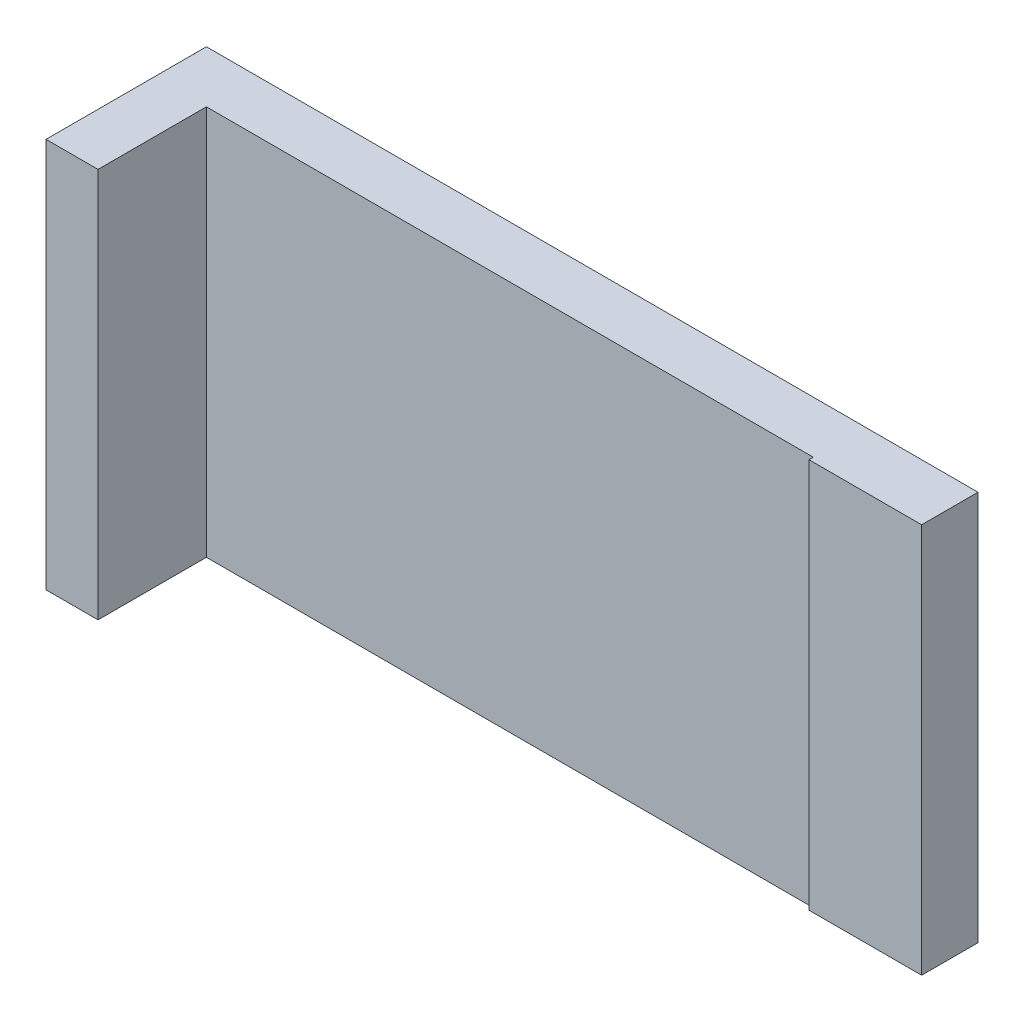
ISO-10303-21;
HEADER;
FILE_DESCRIPTION(('STEP AP214'),'2;1');
FILE_NAME('part.step','',(''),(''),'','','');
FILE_SCHEMA(('AUTOMOTIVE_DESIGN { 1 0 10303 214 1 1 1 1 }'));
ENDSEC;
DATA;
#1=APPLICATION_CONTEXT('core data for automotive mechanical design processes');
#2=APPLICATION_PROTOCOL_DEFINITION('international standard','automotive_design',2000,#1);
#3=PRODUCT_CONTEXT('',#1,'mechanical');
#4=PRODUCT('Part','Part','',(#3));
#5=PRODUCT_RELATED_PRODUCT_CATEGORY('part','',(#4));
#6=PRODUCT_DEFINITION_FORMATION('','',#4);
#7=PRODUCT_DEFINITION_CONTEXT('part definition',#1,'design');
#8=PRODUCT_DEFINITION('design','',#6,#7);
#9=PRODUCT_DEFINITION_SHAPE('','',#8);
#10=(LENGTH_UNIT() NAMED_UNIT(*) SI_UNIT(.MILLI.,.METRE.));
#11=(NAMED_UNIT(*) PLANE_ANGLE_UNIT() SI_UNIT($,.RADIAN.));
#12=(NAMED_UNIT(*) SI_UNIT($,.STERADIAN.) SOLID_ANGLE_UNIT());
#13=UNCERTAINTY_MEASURE_WITH_UNIT(LENGTH_MEASURE(1.E-05),#10,'distance_accuracy_value','');
#14=(GEOMETRIC_REPRESENTATION_CONTEXT(3) GLOBAL_UNCERTAINTY_ASSIGNED_CONTEXT((#13)) GLOBAL_UNIT_ASSIGNED_CONTEXT((#10,
#11,#12)) REPRESENTATION_CONTEXT('',''));
#15=CARTESIAN_POINT('',(0.,0.,0.));
#16=DIRECTION('',(0.,0.,1.));
#17=DIRECTION('',(1.,0.,0.));
#18=AXIS2_PLACEMENT_3D('',#15,#16,#17);
#19=CARTESIAN_POINT('',(0.,0.,0.));
#20=DIRECTION('',(0.,0.,-1.));
#21=DIRECTION('',(-1.,0.,0.));
#22=AXIS2_PLACEMENT_3D('',#19,#20,#21);
#23=PLANE('',#22);
#24=DIRECTION('',(0.,-1.,0.));
#25=VECTOR('',#24,1.);
#26=CARTESIAN_POINT('',(18.75,0.,0.));
#27=LINE('',#26,#25);
#28=CARTESIAN_POINT('',(18.75,11.25,0.));
#29=VERTEX_POINT('',#28);
#30=CARTESIAN_POINT('',(18.75,-11.25,0.));
#31=VERTEX_POINT('',#30);
#32=EDGE_CURVE('E12',#29,#31,#27,.T.);
#33=ORIENTED_EDGE('',*,*,#32,.F.);
#34=DIRECTION('',(-1.,0.,0.));
#35=VECTOR('',#34,1.);
#36=CARTESIAN_POINT('',(-16.25,11.25,0.));
#37=LINE('',#36,#35);
#38=CARTESIAN_POINT('',(-16.25,11.25,0.));
#39=VERTEX_POINT('',#38);
#40=EDGE_CURVE('E151',#29,#39,#37,.T.);
#41=ORIENTED_EDGE('',*,*,#40,.T.);
#42=DIRECTION('',(0.,-1.,0.));
#43=VECTOR('',#42,1.);
#44=CARTESIAN_POINT('',(-16.25,-11.25,0.));
#45=LINE('',#44,#43);
#46=CARTESIAN_POINT('',(-16.25,-11.25,0.));
#47=VERTEX_POINT('',#46);
#48=EDGE_CURVE('E147',#39,#47,#45,.T.);
#49=ORIENTED_EDGE('',*,*,#48,.T.);
#50=DIRECTION('',(1.,0.,0.));
#51=VECTOR('',#50,1.);
#52=CARTESIAN_POINT('',(-16.25,-11.25,0.));
#53=LINE('',#52,#51);
#54=EDGE_CURVE('E53',#47,#31,#53,.T.);
#55=ORIENTED_EDGE('',*,*,#54,.T.);
#56=EDGE_LOOP('',(#33,#41,#49,#55));
#57=FACE_BOUND('',#56,.T.);
#58=ADVANCED_FACE('F35',(#57),#23,.F.);
#59=CARTESIAN_POINT('',(-16.25,11.25,-3.));
#60=DIRECTION('',(0.,1.,0.));
#61=DIRECTION('',(0.,0.,1.));
#62=AXIS2_PLACEMENT_3D('',#59,#60,#61);
#63=PLANE('',#62);
#64=DIRECTION('',(-1.,0.,0.));
#65=VECTOR('',#64,1.);
#66=CARTESIAN_POINT('',(-16.25,11.25,-3.));
#67=LINE('',#66,#65);
#68=CARTESIAN_POINT('',(25.25,11.25,-3.));
#69=VERTEX_POINT('',#68);
#70=CARTESIAN_POINT('',(-19.25,11.25,-3.));
#71=VERTEX_POINT('',#70);
#72=EDGE_CURVE('E154',#69,#71,#67,.T.);
#73=ORIENTED_EDGE('',*,*,#72,.T.);
#74=DIRECTION('',(0.,0.,-1.));
#75=VECTOR('',#74,1.);
#76=CARTESIAN_POINT('',(-19.25,11.25,-3.));
#77=LINE('',#76,#75);
#78=CARTESIAN_POINT('',(-19.25,11.25,6.25000000000003));
#79=VERTEX_POINT('',#78);
#80=EDGE_CURVE('E135',#79,#71,#77,.T.);
#81=ORIENTED_EDGE('',*,*,#80,.F.);
#82=DIRECTION('',(1.,0.,0.));
#83=VECTOR('',#82,1.);
#84=CARTESIAN_POINT('',(-19.25,11.25,6.25000000000003));
#85=LINE('',#84,#83);
#86=CARTESIAN_POINT('',(-16.25,11.25,6.25000000000003));
#87=VERTEX_POINT('',#86);
#88=EDGE_CURVE('E137',#79,#87,#85,.T.);
#89=ORIENTED_EDGE('',*,*,#88,.T.);
#90=DIRECTION('',(0.,0.,-1.));
#91=VECTOR('',#90,1.);
#92=CARTESIAN_POINT('',(-16.25,11.25,-3.));
#93=LINE('',#92,#91);
#94=EDGE_CURVE('E131',#87,#39,#93,.T.);
#95=ORIENTED_EDGE('',*,*,#94,.T.);
#96=ORIENTED_EDGE('',*,*,#40,.F.);
#97=DIRECTION('',(0.,0.,-1.));
#98=VECTOR('',#97,1.);
#99=CARTESIAN_POINT('',(18.75,11.25,23.9200768572607));
#100=LINE('',#99,#98);
#101=CARTESIAN_POINT('',(18.75,11.25,0.250000000000007));
#102=VERTEX_POINT('',#101);
#103=EDGE_CURVE('E105',#102,#29,#100,.T.);
#104=ORIENTED_EDGE('',*,*,#103,.F.);
#105=DIRECTION('',(-1.,0.,0.));
#106=VECTOR('',#105,1.);
#107=CARTESIAN_POINT('',(25.2499999999999,11.25,0.25));
#108=LINE('',#107,#106);
#109=CARTESIAN_POINT('',(25.25,11.25,0.250000000000007));
#110=VERTEX_POINT('',#109);
#111=EDGE_CURVE('E118',#110,#102,#108,.T.);
#112=ORIENTED_EDGE('',*,*,#111,.F.);
#113=DIRECTION('',(0.,0.,1.));
#114=VECTOR('',#113,1.);
#115=CARTESIAN_POINT('',(25.25,11.25,-3.));
#116=LINE('',#115,#114);
#117=EDGE_CURVE('E43',#69,#110,#116,.T.);
#118=ORIENTED_EDGE('',*,*,#117,.F.);
#119=EDGE_LOOP('',(#73,#81,#89,#95,#96,#104,#112,#118));
#120=FACE_BOUND('',#119,.T.);
#121=ADVANCED_FACE('F164',(#120),#63,.T.);
#122=CARTESIAN_POINT('',(25.25,-11.25,-3.));
#123=DIRECTION('',(1.,0.,0.));
#124=DIRECTION('',(0.,0.,-1.));
#125=AXIS2_PLACEMENT_3D('',#122,#123,#124);
#126=PLANE('',#125);
#127=ORIENTED_EDGE('',*,*,#117,.T.);
#128=DIRECTION('',(0.,1.,0.));
#129=VECTOR('',#128,1.);
#130=CARTESIAN_POINT('',(25.25,-11.25,0.25));
#131=LINE('',#130,#129);
#132=CARTESIAN_POINT('',(25.25,-11.25,0.25));
#133=VERTEX_POINT('',#132);
#134=EDGE_CURVE('E113',#133,#110,#131,.T.);
#135=ORIENTED_EDGE('',*,*,#134,.F.);
#136=DIRECTION('',(0.,0.,1.));
#137=VECTOR('',#136,1.);
#138=CARTESIAN_POINT('',(25.25,-11.25,-3.));
#139=LINE('',#138,#137);
#140=CARTESIAN_POINT('',(25.25,-11.25,-3.));
#141=VERTEX_POINT('',#140);
#142=EDGE_CURVE('E109',#141,#133,#139,.T.);
#143=ORIENTED_EDGE('',*,*,#142,.F.);
#144=DIRECTION('',(0.,1.,0.));
#145=VECTOR('',#144,1.);
#146=CARTESIAN_POINT('',(25.25,-11.25,-3.));
#147=LINE('',#146,#145);
#148=EDGE_CURVE('E150',#141,#69,#147,.T.);
#149=ORIENTED_EDGE('',*,*,#148,.T.);
#150=EDGE_LOOP('',(#127,#135,#143,#149));
#151=FACE_BOUND('',#150,.T.);
#152=ADVANCED_FACE('F160',(#151),#126,.T.);
#153=CARTESIAN_POINT('',(-16.25,-11.25,-3.));
#154=DIRECTION('',(0.,-1.,0.));
#155=DIRECTION('',(0.,0.,-1.));
#156=AXIS2_PLACEMENT_3D('',#153,#154,#155);
#157=PLANE('',#156);
#158=DIRECTION('',(0.,0.,-1.));
#159=VECTOR('',#158,1.);
#160=CARTESIAN_POINT('',(18.75,-11.25,23.9200768572607));
#161=LINE('',#160,#159);
#162=CARTESIAN_POINT('',(18.75,-11.25,0.250000000000007));
#163=VERTEX_POINT('',#162);
#164=EDGE_CURVE('E96',#163,#31,#161,.T.);
#165=ORIENTED_EDGE('',*,*,#164,.T.);
#166=ORIENTED_EDGE('',*,*,#54,.F.);
#167=DIRECTION('',(0.,0.,1.));
#168=VECTOR('',#167,1.);
#169=CARTESIAN_POINT('',(-16.25,-11.25,-3.));
#170=LINE('',#169,#168);
#171=CARTESIAN_POINT('',(-16.25,-11.25,6.25000000000003));
#172=VERTEX_POINT('',#171);
#173=EDGE_CURVE('E119',#47,#172,#170,.T.);
#174=ORIENTED_EDGE('',*,*,#173,.T.);
#175=DIRECTION('',(1.,0.,0.));
#176=VECTOR('',#175,1.);
#177=CARTESIAN_POINT('',(-19.25,-11.25,6.25000000000003));
#178=LINE('',#177,#176);
#179=CARTESIAN_POINT('',(-19.25,-11.25,6.25000000000003));
#180=VERTEX_POINT('',#179);
#181=EDGE_CURVE('E144',#180,#172,#178,.T.);
#182=ORIENTED_EDGE('',*,*,#181,.F.);
#183=DIRECTION('',(0.,0.,1.));
#184=VECTOR('',#183,1.);
#185=CARTESIAN_POINT('',(-19.25,-11.25,-3.));
#186=LINE('',#185,#184);
#187=CARTESIAN_POINT('',(-19.25,-11.25,-3.));
#188=VERTEX_POINT('',#187);
#189=EDGE_CURVE('E130',#188,#180,#186,.T.);
#190=ORIENTED_EDGE('',*,*,#189,.F.);
#191=DIRECTION('',(1.,0.,0.));
#192=VECTOR('',#191,1.);
#193=CARTESIAN_POINT('',(-16.25,-11.25,-3.));
#194=LINE('',#193,#192);
#195=EDGE_CURVE('E148',#188,#141,#194,.T.);
#196=ORIENTED_EDGE('',*,*,#195,.T.);
#197=ORIENTED_EDGE('',*,*,#142,.T.);
#198=DIRECTION('',(1.,0.,0.));
#199=VECTOR('',#198,1.);
#200=CARTESIAN_POINT('',(25.25,-11.25,0.25));
#201=LINE('',#200,#199);
#202=EDGE_CURVE('E104',#163,#133,#201,.T.);
#203=ORIENTED_EDGE('',*,*,#202,.F.);
#204=EDGE_LOOP('',(#165,#166,#174,#182,#190,#196,#197,#203));
#205=FACE_BOUND('',#204,.T.);
#206=ADVANCED_FACE('F37',(#205),#157,.T.);
#207=CARTESIAN_POINT('',(0.,0.,-3.));
#208=DIRECTION('',(0.,0.,-1.));
#209=DIRECTION('',(-1.,0.,0.));
#210=AXIS2_PLACEMENT_3D('',#207,#208,#209);
#211=PLANE('',#210);
#212=ORIENTED_EDGE('',*,*,#148,.F.);
#213=ORIENTED_EDGE('',*,*,#195,.F.);
#214=DIRECTION('',(0.,-1.,0.));
#215=VECTOR('',#214,1.);
#216=CARTESIAN_POINT('',(-19.25,-11.25,-3.));
#217=LINE('',#216,#215);
#218=EDGE_CURVE('E127',#71,#188,#217,.T.);
#219=ORIENTED_EDGE('',*,*,#218,.F.);
#220=ORIENTED_EDGE('',*,*,#72,.F.);
#221=EDGE_LOOP('',(#212,#213,#219,#220));
#222=FACE_BOUND('',#221,.T.);
#223=ADVANCED_FACE('F181',(#222),#211,.T.);
#224=CARTESIAN_POINT('',(-16.25,0.,0.));
#225=DIRECTION('',(1.,0.,0.));
#226=DIRECTION('',(0.,0.,-1.));
#227=AXIS2_PLACEMENT_3D('',#224,#225,#226);
#228=PLANE('',#227);
#229=ORIENTED_EDGE('',*,*,#48,.F.);
#230=ORIENTED_EDGE('',*,*,#94,.F.);
#231=DIRECTION('',(0.,1.,0.));
#232=VECTOR('',#231,1.);
#233=CARTESIAN_POINT('',(-16.25,-11.25,6.25000000000003));
#234=LINE('',#233,#232);
#235=EDGE_CURVE('E121',#172,#87,#234,.T.);
#236=ORIENTED_EDGE('',*,*,#235,.F.);
#237=ORIENTED_EDGE('',*,*,#173,.F.);
#238=EDGE_LOOP('',(#229,#230,#236,#237));
#239=FACE_BOUND('',#238,.T.);
#240=ADVANCED_FACE('F168',(#239),#228,.T.);
#241=CARTESIAN_POINT('',(-19.25,-11.25,6.25000000000003));
#242=DIRECTION('',(0.,0.,-1.));
#243=DIRECTION('',(-1.,0.,0.));
#244=AXIS2_PLACEMENT_3D('',#241,#242,#243);
#245=PLANE('',#244);
#246=ORIENTED_EDGE('',*,*,#235,.T.);
#247=ORIENTED_EDGE('',*,*,#88,.F.);
#248=DIRECTION('',(0.,1.,0.));
#249=VECTOR('',#248,1.);
#250=CARTESIAN_POINT('',(-19.25,-11.25,6.25000000000003));
#251=LINE('',#250,#249);
#252=EDGE_CURVE('E133',#180,#79,#251,.T.);
#253=ORIENTED_EDGE('',*,*,#252,.F.);
#254=ORIENTED_EDGE('',*,*,#181,.T.);
#255=EDGE_LOOP('',(#246,#247,#253,#254));
#256=FACE_BOUND('',#255,.T.);
#257=ADVANCED_FACE('F174',(#256),#245,.F.);
#258=CARTESIAN_POINT('',(-19.25,0.,0.));
#259=DIRECTION('',(1.,0.,0.));
#260=DIRECTION('',(0.,0.,-1.));
#261=AXIS2_PLACEMENT_3D('',#258,#259,#260);
#262=PLANE('',#261);
#263=ORIENTED_EDGE('',*,*,#218,.T.);
#264=ORIENTED_EDGE('',*,*,#189,.T.);
#265=ORIENTED_EDGE('',*,*,#252,.T.);
#266=ORIENTED_EDGE('',*,*,#80,.T.);
#267=EDGE_LOOP('',(#263,#264,#265,#266));
#268=FACE_BOUND('',#267,.T.);
#269=ADVANCED_FACE('F178',(#268),#262,.F.);
#270=CARTESIAN_POINT('',(18.75,-11.25,23.9200768572607));
#271=DIRECTION('',(1.,0.,0.));
#272=DIRECTION('',(0.,1.,0.));
#273=AXIS2_PLACEMENT_3D('',#270,#271,#272);
#274=PLANE('',#273);
#275=ORIENTED_EDGE('',*,*,#103,.T.);
#276=ORIENTED_EDGE('',*,*,#32,.T.);
#277=ORIENTED_EDGE('',*,*,#164,.F.);
#278=DIRECTION('',(0.,-1.,0.));
#279=VECTOR('',#278,1.);
#280=CARTESIAN_POINT('',(18.75,-11.25,0.25));
#281=LINE('',#280,#279);
#282=EDGE_CURVE('E101',#102,#163,#281,.T.);
#283=ORIENTED_EDGE('',*,*,#282,.F.);
#284=EDGE_LOOP('',(#275,#276,#277,#283));
#285=FACE_BOUND('',#284,.T.);
#286=ADVANCED_FACE('F99',(#285),#274,.F.);
#287=CARTESIAN_POINT('',(35.5,22.75,0.25));
#288=DIRECTION('',(0.,0.,1.));
#289=DIRECTION('',(0.,1.,0.));
#290=AXIS2_PLACEMENT_3D('',#287,#288,#289);
#291=PLANE('',#290);
#292=ORIENTED_EDGE('',*,*,#202,.T.);
#293=ORIENTED_EDGE('',*,*,#134,.T.);
#294=ORIENTED_EDGE('',*,*,#111,.T.);
#295=ORIENTED_EDGE('',*,*,#282,.T.);
#296=EDGE_LOOP('',(#292,#293,#294,#295));
#297=FACE_BOUND('',#296,.T.);
#298=ADVANCED_FACE('F116',(#297),#291,.T.);
#299=CLOSED_SHELL('',(#58,#121,#152,#206,#223,#240,#257,#269,#286,#298));
#300=MANIFOLD_SOLID_BREP('B2',#299);
#301=ADVANCED_BREP_SHAPE_REPRESENTATION('',(#18,#300),#14);
#302=SHAPE_DEFINITION_REPRESENTATION(#9,#301);
ENDSEC;
END-ISO-10303-21;
